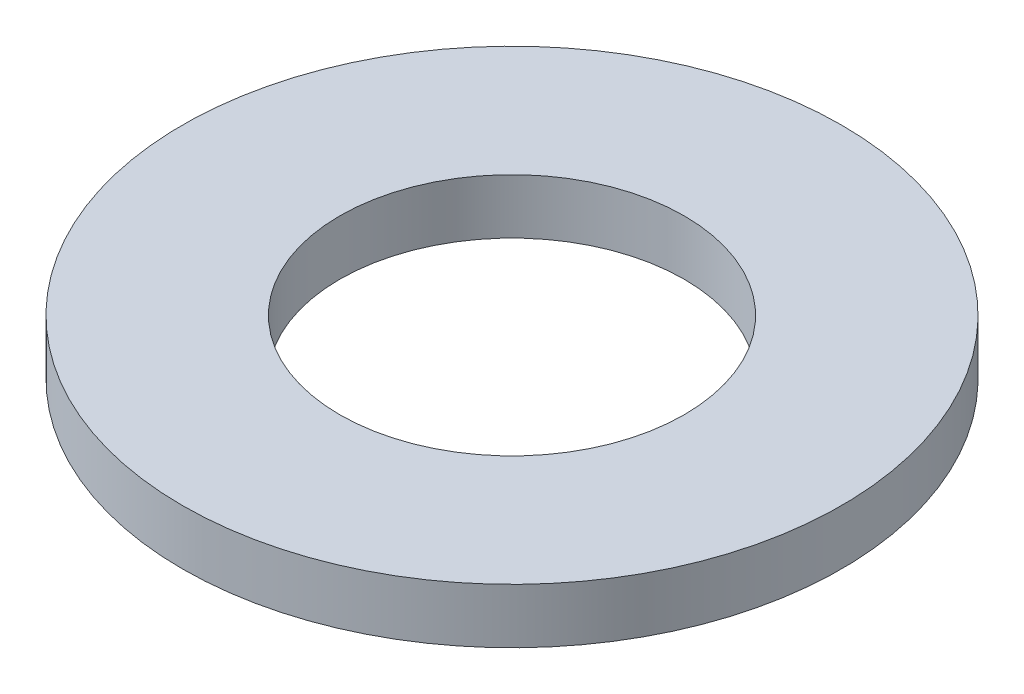
ISO-10303-21;
HEADER;
FILE_DESCRIPTION(('STEP AP214'),'2;1');
FILE_NAME('part.step','',(''),(''),'','','');
FILE_SCHEMA(('AUTOMOTIVE_DESIGN { 1 0 10303 214 1 1 1 1 }'));
ENDSEC;
DATA;
#1=APPLICATION_CONTEXT('core data for automotive mechanical design processes');
#2=APPLICATION_PROTOCOL_DEFINITION('international standard','automotive_design',2000,#1);
#3=PRODUCT_CONTEXT('',#1,'mechanical');
#4=PRODUCT('Part','Part','',(#3));
#5=PRODUCT_RELATED_PRODUCT_CATEGORY('part','',(#4));
#6=PRODUCT_DEFINITION_FORMATION('','',#4);
#7=PRODUCT_DEFINITION_CONTEXT('part definition',#1,'design');
#8=PRODUCT_DEFINITION('design','',#6,#7);
#9=PRODUCT_DEFINITION_SHAPE('','',#8);
#10=(LENGTH_UNIT() NAMED_UNIT(*) SI_UNIT(.MILLI.,.METRE.));
#11=(NAMED_UNIT(*) PLANE_ANGLE_UNIT() SI_UNIT($,.RADIAN.));
#12=(NAMED_UNIT(*) SI_UNIT($,.STERADIAN.) SOLID_ANGLE_UNIT());
#13=UNCERTAINTY_MEASURE_WITH_UNIT(LENGTH_MEASURE(1.E-05),#10,'distance_accuracy_value','');
#14=(GEOMETRIC_REPRESENTATION_CONTEXT(3) GLOBAL_UNCERTAINTY_ASSIGNED_CONTEXT((#13)) GLOBAL_UNIT_ASSIGNED_CONTEXT((#10,
#11,#12)) REPRESENTATION_CONTEXT('',''));
#15=CARTESIAN_POINT('',(0.,0.,0.));
#16=DIRECTION('',(0.,0.,1.));
#17=DIRECTION('',(1.,0.,0.));
#18=AXIS2_PLACEMENT_3D('',#15,#16,#17);
#19=CARTESIAN_POINT('',(0.,0.79375,0.));
#20=DIRECTION('',(0.,1.,0.));
#21=DIRECTION('',(0.,0.,1.));
#22=AXIS2_PLACEMENT_3D('',#19,#20,#21);
#23=PLANE('',#22);
#24=CARTESIAN_POINT('',(0.,0.79375,0.));
#25=DIRECTION('',(0.,1.,0.));
#26=DIRECTION('',(0.,0.,1.));
#27=AXIS2_PLACEMENT_3D('',#24,#25,#26);
#28=CIRCLE('',#27,4.7625);
#29=CARTESIAN_POINT('',(0.,0.79375,4.7625));
#30=VERTEX_POINT('',#29);
#31=EDGE_CURVE('E10',#30,#30,#28,.T.);
#32=ORIENTED_EDGE('',*,*,#31,.T.);
#33=EDGE_LOOP('',(#32));
#34=FACE_BOUND('',#33,.T.);
#35=CARTESIAN_POINT('',(0.,0.79375,0.));
#36=DIRECTION('',(0.,1.,0.));
#37=DIRECTION('',(0.,0.,1.));
#38=AXIS2_PLACEMENT_3D('',#35,#36,#37);
#39=CIRCLE('',#38,2.4892);
#40=CARTESIAN_POINT('',(0.,0.79375,2.4892));
#41=VERTEX_POINT('',#40);
#42=EDGE_CURVE('E48',#41,#41,#39,.T.);
#43=ORIENTED_EDGE('',*,*,#42,.F.);
#44=EDGE_LOOP('',(#43));
#45=FACE_BOUND('',#44,.T.);
#46=ADVANCED_FACE('F37',(#34,#45),#23,.T.);
#47=CARTESIAN_POINT('',(0.,0.,0.));
#48=DIRECTION('',(0.,1.,0.));
#49=DIRECTION('',(0.,0.,1.));
#50=AXIS2_PLACEMENT_3D('',#47,#48,#49);
#51=PLANE('',#50);
#52=CARTESIAN_POINT('',(0.,0.,0.));
#53=DIRECTION('',(0.,1.,0.));
#54=DIRECTION('',(0.,0.,1.));
#55=AXIS2_PLACEMENT_3D('',#52,#53,#54);
#56=CIRCLE('',#55,4.7625);
#57=CARTESIAN_POINT('',(0.,0.,4.7625));
#58=VERTEX_POINT('',#57);
#59=EDGE_CURVE('E41',#58,#58,#56,.T.);
#60=ORIENTED_EDGE('',*,*,#59,.F.);
#61=EDGE_LOOP('',(#60));
#62=FACE_BOUND('',#61,.T.);
#63=CARTESIAN_POINT('',(0.,0.,0.));
#64=DIRECTION('',(0.,1.,0.));
#65=DIRECTION('',(0.,0.,1.));
#66=AXIS2_PLACEMENT_3D('',#63,#64,#65);
#67=CIRCLE('',#66,2.4892);
#68=CARTESIAN_POINT('',(0.,0.,2.4892));
#69=VERTEX_POINT('',#68);
#70=EDGE_CURVE('E50',#69,#69,#67,.T.);
#71=ORIENTED_EDGE('',*,*,#70,.T.);
#72=EDGE_LOOP('',(#71));
#73=FACE_BOUND('',#72,.T.);
#74=ADVANCED_FACE('F60',(#62,#73),#51,.F.);
#75=CARTESIAN_POINT('',(0.,0.79375,0.));
#76=DIRECTION('',(0.,-1.,0.));
#77=DIRECTION('',(0.,0.,-1.));
#78=AXIS2_PLACEMENT_3D('',#75,#76,#77);
#79=CYLINDRICAL_SURFACE('',#78,4.7625);
#80=ORIENTED_EDGE('',*,*,#31,.F.);
#81=EDGE_LOOP('',(#80));
#82=FACE_BOUND('',#81,.T.);
#83=ORIENTED_EDGE('',*,*,#59,.T.);
#84=EDGE_LOOP('',(#83));
#85=FACE_BOUND('',#84,.T.);
#86=ADVANCED_FACE('F39',(#82,#85),#79,.T.);
#87=CARTESIAN_POINT('',(0.,0.79375,0.));
#88=DIRECTION('',(0.,-1.,0.));
#89=DIRECTION('',(0.,0.,-1.));
#90=AXIS2_PLACEMENT_3D('',#87,#88,#89);
#91=CYLINDRICAL_SURFACE('',#90,2.4892);
#92=ORIENTED_EDGE('',*,*,#42,.T.);
#93=EDGE_LOOP('',(#92));
#94=FACE_BOUND('',#93,.T.);
#95=ORIENTED_EDGE('',*,*,#70,.F.);
#96=EDGE_LOOP('',(#95));
#97=FACE_BOUND('',#96,.T.);
#98=ADVANCED_FACE('F56',(#94,#97),#91,.F.);
#99=CLOSED_SHELL('',(#46,#74,#86,#98));
#100=MANIFOLD_SOLID_BREP('B2',#99);
#101=ADVANCED_BREP_SHAPE_REPRESENTATION('',(#18,#100),#14);
#102=SHAPE_DEFINITION_REPRESENTATION(#9,#101);
ENDSEC;
END-ISO-10303-21;
